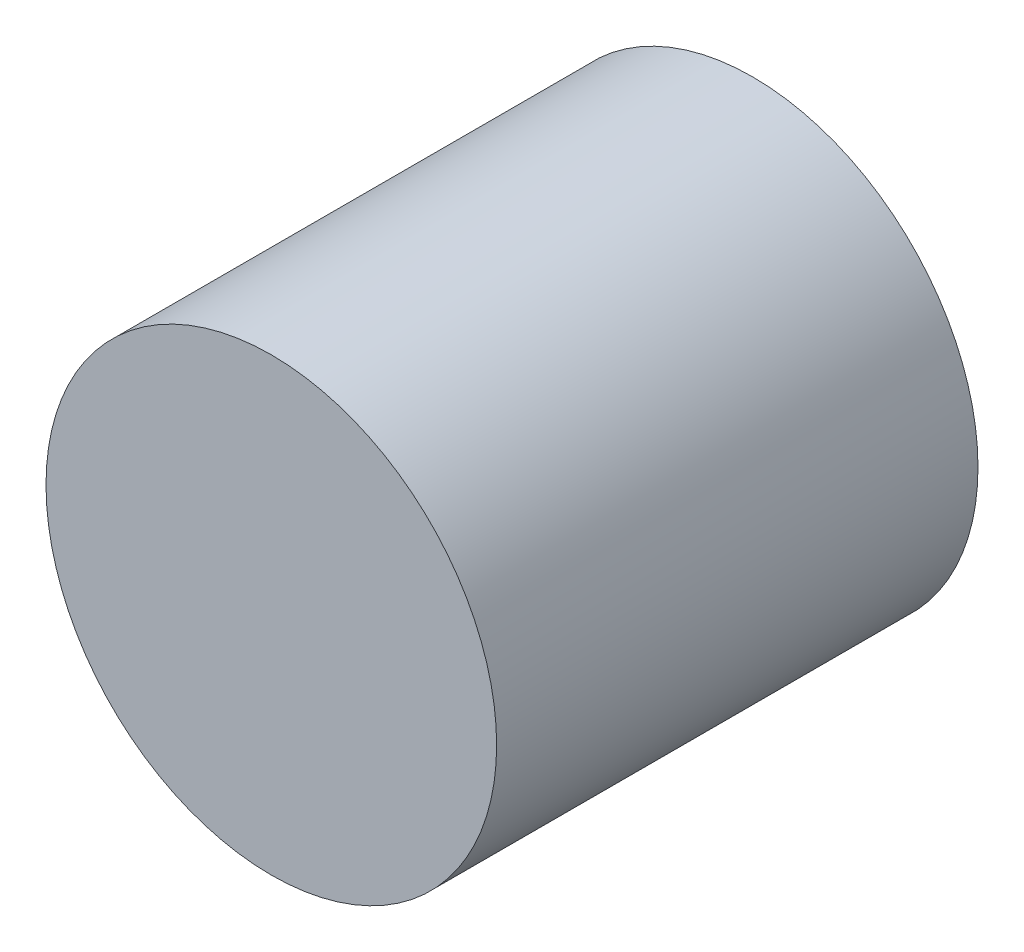
ISO-10303-21;
HEADER;
FILE_DESCRIPTION(('STEP AP214'),'2;1');
FILE_NAME('part.step','',(''),(''),'','','');
FILE_SCHEMA(('AUTOMOTIVE_DESIGN { 1 0 10303 214 1 1 1 1 }'));
ENDSEC;
DATA;
#1=APPLICATION_CONTEXT('core data for automotive mechanical design processes');
#2=APPLICATION_PROTOCOL_DEFINITION('international standard','automotive_design',2000,#1);
#3=PRODUCT_CONTEXT('',#1,'mechanical');
#4=PRODUCT('Part','Part','',(#3));
#5=PRODUCT_RELATED_PRODUCT_CATEGORY('part','',(#4));
#6=PRODUCT_DEFINITION_FORMATION('','',#4);
#7=PRODUCT_DEFINITION_CONTEXT('part definition',#1,'design');
#8=PRODUCT_DEFINITION('design','',#6,#7);
#9=PRODUCT_DEFINITION_SHAPE('','',#8);
#10=(LENGTH_UNIT() NAMED_UNIT(*) SI_UNIT(.MILLI.,.METRE.));
#11=(NAMED_UNIT(*) PLANE_ANGLE_UNIT() SI_UNIT($,.RADIAN.));
#12=(NAMED_UNIT(*) SI_UNIT($,.STERADIAN.) SOLID_ANGLE_UNIT());
#13=UNCERTAINTY_MEASURE_WITH_UNIT(LENGTH_MEASURE(1.E-05),#10,'distance_accuracy_value','');
#14=(GEOMETRIC_REPRESENTATION_CONTEXT(3) GLOBAL_UNCERTAINTY_ASSIGNED_CONTEXT((#13)) GLOBAL_UNIT_ASSIGNED_CONTEXT((#10,
#11,#12)) REPRESENTATION_CONTEXT('',''));
#15=CARTESIAN_POINT('',(0.,0.,0.));
#16=DIRECTION('',(0.,0.,1.));
#17=DIRECTION('',(1.,0.,0.));
#18=AXIS2_PLACEMENT_3D('',#15,#16,#17);
#19=CARTESIAN_POINT('',(0.,0.,11.938));
#20=DIRECTION('',(0.,0.,-1.));
#21=DIRECTION('',(-1.,0.,0.));
#22=AXIS2_PLACEMENT_3D('',#19,#20,#21);
#23=CYLINDRICAL_SURFACE('',#22,5.588);
#24=CARTESIAN_POINT('',(0.,0.,11.938));
#25=DIRECTION('',(0.,0.,1.));
#26=DIRECTION('',(1.,0.,0.));
#27=AXIS2_PLACEMENT_3D('',#24,#25,#26);
#28=CIRCLE('',#27,5.588);
#29=CARTESIAN_POINT('',(5.588,0.,11.938));
#30=VERTEX_POINT('',#29);
#31=EDGE_CURVE('E10',#30,#30,#28,.T.);
#32=ORIENTED_EDGE('',*,*,#31,.F.);
#33=EDGE_LOOP('',(#32));
#34=FACE_BOUND('',#33,.T.);
#35=CARTESIAN_POINT('',(0.,0.,0.));
#36=DIRECTION('',(0.,0.,1.));
#37=DIRECTION('',(1.,0.,0.));
#38=AXIS2_PLACEMENT_3D('',#35,#36,#37);
#39=CIRCLE('',#38,5.588);
#40=CARTESIAN_POINT('',(5.588,0.,0.));
#41=VERTEX_POINT('',#40);
#42=EDGE_CURVE('E40',#41,#41,#39,.T.);
#43=ORIENTED_EDGE('',*,*,#42,.T.);
#44=EDGE_LOOP('',(#43));
#45=FACE_BOUND('',#44,.T.);
#46=ADVANCED_FACE('F37',(#34,#45),#23,.T.);
#47=CARTESIAN_POINT('',(0.,0.,11.938));
#48=DIRECTION('',(0.,0.,1.));
#49=DIRECTION('',(1.,0.,0.));
#50=AXIS2_PLACEMENT_3D('',#47,#48,#49);
#51=PLANE('',#50);
#52=ORIENTED_EDGE('',*,*,#31,.T.);
#53=EDGE_LOOP('',(#52));
#54=FACE_BOUND('',#53,.T.);
#55=ADVANCED_FACE('F54',(#54),#51,.T.);
#56=CARTESIAN_POINT('',(0.,0.,0.));
#57=DIRECTION('',(0.,0.,1.));
#58=DIRECTION('',(1.,0.,0.));
#59=AXIS2_PLACEMENT_3D('',#56,#57,#58);
#60=PLANE('',#59);
#61=ORIENTED_EDGE('',*,*,#42,.F.);
#62=EDGE_LOOP('',(#61));
#63=FACE_BOUND('',#62,.T.);
#64=ADVANCED_FACE('F52',(#63),#60,.F.);
#65=CLOSED_SHELL('',(#46,#55,#64));
#66=MANIFOLD_SOLID_BREP('B2',#65);
#67=ADVANCED_BREP_SHAPE_REPRESENTATION('',(#18,#66),#14);
#68=SHAPE_DEFINITION_REPRESENTATION(#9,#67);
ENDSEC;
END-ISO-10303-21;
